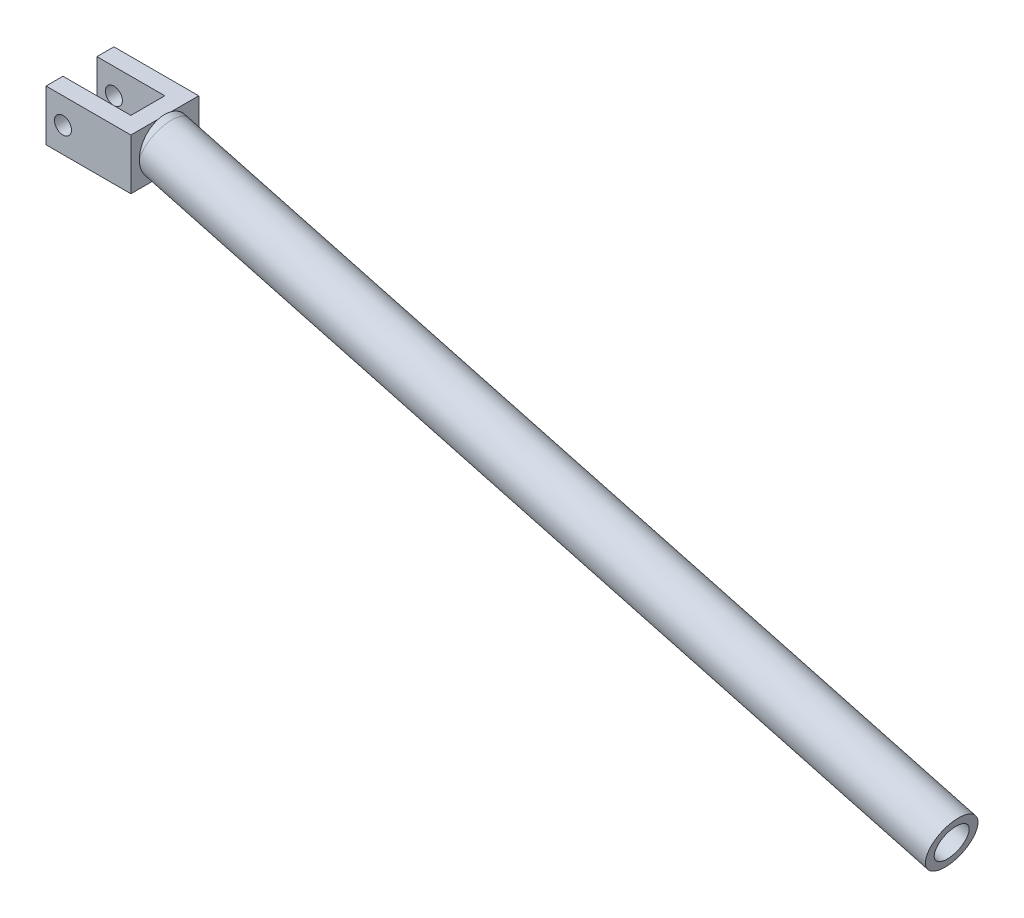
ISO-10303-21;
HEADER;
FILE_DESCRIPTION(('STEP AP214'),'2;1');
FILE_NAME('part.step','',(''),(''),'','','');
FILE_SCHEMA(('AUTOMOTIVE_DESIGN { 1 0 10303 214 1 1 1 1 }'));
ENDSEC;
DATA;
#1=APPLICATION_CONTEXT('core data for automotive mechanical design processes');
#2=APPLICATION_PROTOCOL_DEFINITION('international standard','automotive_design',2000,#1);
#3=PRODUCT_CONTEXT('',#1,'mechanical');
#4=PRODUCT('Part','Part','',(#3));
#5=PRODUCT_RELATED_PRODUCT_CATEGORY('part','',(#4));
#6=PRODUCT_DEFINITION_FORMATION('','',#4);
#7=PRODUCT_DEFINITION_CONTEXT('part definition',#1,'design');
#8=PRODUCT_DEFINITION('design','',#6,#7);
#9=PRODUCT_DEFINITION_SHAPE('','',#8);
#10=(LENGTH_UNIT() NAMED_UNIT(*) SI_UNIT(.MILLI.,.METRE.));
#11=(NAMED_UNIT(*) PLANE_ANGLE_UNIT() SI_UNIT($,.RADIAN.));
#12=(NAMED_UNIT(*) SI_UNIT($,.STERADIAN.) SOLID_ANGLE_UNIT());
#13=UNCERTAINTY_MEASURE_WITH_UNIT(LENGTH_MEASURE(1.E-05),#10,'distance_accuracy_value','');
#14=(GEOMETRIC_REPRESENTATION_CONTEXT(3) GLOBAL_UNCERTAINTY_ASSIGNED_CONTEXT((#13)) GLOBAL_UNIT_ASSIGNED_CONTEXT((#10,
#11,#12)) REPRESENTATION_CONTEXT('',''));
#15=CARTESIAN_POINT('',(0.,0.,0.));
#16=DIRECTION('',(0.,0.,1.));
#17=DIRECTION('',(1.,0.,0.));
#18=AXIS2_PLACEMENT_3D('',#15,#16,#17);
#19=CARTESIAN_POINT('',(-12.7,0.,0.));
#20=DIRECTION('',(1.,0.,0.));
#21=DIRECTION('',(0.,0.,-1.));
#22=AXIS2_PLACEMENT_3D('',#19,#20,#21);
#23=PLANE('',#22);
#24=DIRECTION('',(0.,1.,0.));
#25=VECTOR('',#24,1.);
#26=CARTESIAN_POINT('',(-12.7,19.05,-12.7000000000001));
#27=LINE('',#26,#25);
#28=CARTESIAN_POINT('',(-12.7,-19.05,-12.6999999999999));
#29=VERTEX_POINT('',#28);
#30=CARTESIAN_POINT('',(-12.7,19.05,-12.6999999999999));
#31=VERTEX_POINT('',#30);
#32=EDGE_CURVE('E176',#29,#31,#27,.T.);
#33=ORIENTED_EDGE('',*,*,#32,.F.);
#34=DIRECTION('',(0.,0.,-1.));
#35=VECTOR('',#34,1.);
#36=CARTESIAN_POINT('',(-12.7,-19.05,-25.4));
#37=LINE('',#36,#35);
#38=CARTESIAN_POINT('',(-12.7,-19.05,12.7));
#39=VERTEX_POINT('',#38);
#40=EDGE_CURVE('E208',#39,#29,#37,.T.);
#41=ORIENTED_EDGE('',*,*,#40,.F.);
#42=DIRECTION('',(0.,-1.,0.));
#43=VECTOR('',#42,1.);
#44=CARTESIAN_POINT('',(-12.7,19.05,12.7));
#45=LINE('',#44,#43);
#46=CARTESIAN_POINT('',(-12.7,19.05,12.7));
#47=VERTEX_POINT('',#46);
#48=EDGE_CURVE('E188',#47,#39,#45,.T.);
#49=ORIENTED_EDGE('',*,*,#48,.F.);
#50=DIRECTION('',(0.,0.,1.));
#51=VECTOR('',#50,1.);
#52=CARTESIAN_POINT('',(-12.7,19.05,-25.4));
#53=LINE('',#52,#51);
#54=EDGE_CURVE('E81',#31,#47,#53,.T.);
#55=ORIENTED_EDGE('',*,*,#54,.F.);
#56=EDGE_LOOP('',(#33,#41,#49,#55));
#57=FACE_BOUND('',#56,.T.);
#58=ADVANCED_FACE('F57',(#57),#23,.F.);
#59=CARTESIAN_POINT('',(0.,0.,0.));
#60=DIRECTION('',(1.,0.,0.));
#61=DIRECTION('',(0.,0.,-1.));
#62=AXIS2_PLACEMENT_3D('',#59,#60,#61);
#63=PLANE('',#62);
#64=CARTESIAN_POINT('',(0.,0.,0.));
#65=DIRECTION('',(1.,0.,0.));
#66=DIRECTION('',(0.,-1.,1.47620540963971E-12));
#67=AXIS2_PLACEMENT_3D('',#64,#65,#66);
#68=ELLIPSE('',#67,19.7220112368121,19.05);
#69=CARTESIAN_POINT('',(0.,-19.05,4.93050280920487));
#70=VERTEX_POINT('',#69);
#71=CARTESIAN_POINT('',(0.,-19.05,-4.9305028092011));
#72=VERTEX_POINT('',#71);
#73=EDGE_CURVE('E232',#70,#72,#68,.T.);
#74=ORIENTED_EDGE('',*,*,#73,.F.);
#75=DIRECTION('',(0.,0.,-1.));
#76=VECTOR('',#75,1.);
#77=CARTESIAN_POINT('',(0.,-19.05,-25.4));
#78=LINE('',#77,#76);
#79=EDGE_CURVE('E12',#70,#72,#78,.T.);
#80=ORIENTED_EDGE('',*,*,#79,.T.);
#81=EDGE_LOOP('',(#74,#80));
#82=FACE_BOUND('',#81,.T.);
#83=ADVANCED_FACE('F270',(#82),#63,.F.);
#84=CARTESIAN_POINT('',(588.828383705816,-157.776089894497,2.32909917414058E-10));
#85=DIRECTION('',(-0.965925826289068,0.258819045102521,-3.82070074498127E-13));
#86=DIRECTION('',(-0.258819045102521,-0.965925826289068,0.));
#87=AXIS2_PLACEMENT_3D('',#84,#85,#86);
#88=PLANE('',#87);
#89=CARTESIAN_POINT('',(588.828383705816,-157.776089894497,2.32909917414058E-10));
#90=DIRECTION('',(-0.965925826289068,0.258819045102521,-3.82070074498127E-13));
#91=DIRECTION('',(-0.258819045102521,-0.965925826289068,0.));
#92=AXIS2_PLACEMENT_3D('',#89,#90,#91);
#93=CIRCLE('',#92,12.7);
#94=CARTESIAN_POINT('',(585.541381833014,-170.043347888368,2.32909917414058E-10));
#95=VERTEX_POINT('',#94);
#96=EDGE_CURVE('E238',#95,#95,#93,.T.);
#97=ORIENTED_EDGE('',*,*,#96,.T.);
#98=EDGE_LOOP('',(#97));
#99=FACE_BOUND('',#98,.T.);
#100=CARTESIAN_POINT('',(588.828383705816,-157.776089894497,2.32909917414058E-10));
#101=DIRECTION('',(-0.965925826289068,0.258819045102521,-3.82070074498127E-13));
#102=DIRECTION('',(-0.258819045102521,-0.965925826289068,0.));
#103=AXIS2_PLACEMENT_3D('',#100,#101,#102);
#104=CIRCLE('',#103,19.05);
#105=CARTESIAN_POINT('',(583.897880896613,-176.176976885304,2.32909917414058E-10));
#106=VERTEX_POINT('',#105);
#107=EDGE_CURVE('E245',#106,#106,#104,.T.);
#108=ORIENTED_EDGE('',*,*,#107,.F.);
#109=EDGE_LOOP('',(#108));
#110=FACE_BOUND('',#109,.T.);
#111=ADVANCED_FACE('F59',(#99,#110),#88,.F.);
#112=CARTESIAN_POINT('',(-24.5345159877425,6.5740037456041,-9.70457989225221E-12));
#113=DIRECTION('',(0.965925826289068,-0.258819045102521,3.82070074498126E-13));
#114=DIRECTION('',(0.258819045102521,0.965925826289068,0.));
#115=AXIS2_PLACEMENT_3D('',#112,#113,#114);
#116=CYLINDRICAL_SURFACE('',#115,19.05);
#117=CARTESIAN_POINT('',(-1.11022302462516E-13,0.,0.));
#118=DIRECTION('',(-0.965925826289068,0.258819045102521,-3.82070074498127E-13));
#119=DIRECTION('',(-0.258819045102521,-0.965925826289068,0.));
#120=AXIS2_PLACEMENT_3D('',#117,#118,#119);
#121=CIRCLE('',#120,19.05);
#122=CARTESIAN_POINT('',(0.,2.85915650784312E-11,19.05));
#123=VERTEX_POINT('',#122);
#124=CARTESIAN_POINT('',(0.,-2.76518610288419E-11,-19.05));
#125=VERTEX_POINT('',#124);
#126=EDGE_CURVE('E241',#123,#125,#121,.T.);
#127=ORIENTED_EDGE('',*,*,#126,.T.);
#128=CARTESIAN_POINT('',(0.,0.,0.));
#129=DIRECTION('',(1.,0.,0.));
#130=DIRECTION('',(0.,-1.,1.47620540963971E-12));
#131=AXIS2_PLACEMENT_3D('',#128,#129,#130);
#132=ELLIPSE('',#131,19.7220112368121,19.05);
#133=CARTESIAN_POINT('',(0.,19.05,-4.93050280920503));
#134=VERTEX_POINT('',#133);
#135=EDGE_CURVE('E233',#125,#134,#132,.T.);
#136=ORIENTED_EDGE('',*,*,#135,.T.);
#137=CARTESIAN_POINT('',(0.,19.05,4.93050280920127));
#138=VERTEX_POINT('',#137);
#139=EDGE_CURVE('E237',#134,#138,#132,.T.);
#140=ORIENTED_EDGE('',*,*,#139,.T.);
#141=EDGE_CURVE('E231',#138,#123,#132,.T.);
#142=ORIENTED_EDGE('',*,*,#141,.T.);
#143=EDGE_LOOP('',(#127,#136,#140,#142));
#144=FACE_BOUND('',#143,.T.);
#145=ADVANCED_FACE('F276',(#144),#116,.T.);
#146=CARTESIAN_POINT('',(0.,0.,0.));
#147=DIRECTION('',(0.965925826289068,-0.258819045102521,3.82070074498127E-13));
#148=DIRECTION('',(0.258819045102521,0.965925826289068,0.));
#149=AXIS2_PLACEMENT_3D('',#146,#147,#148);
#150=CYLINDRICAL_SURFACE('',#149,19.05);
#151=ORIENTED_EDGE('',*,*,#107,.T.);
#152=EDGE_LOOP('',(#151));
#153=FACE_BOUND('',#152,.T.);
#154=ORIENTED_EDGE('',*,*,#126,.F.);
#155=EDGE_CURVE('E228',#123,#70,#68,.T.);
#156=ORIENTED_EDGE('',*,*,#155,.T.);
#157=ORIENTED_EDGE('',*,*,#73,.T.);
#158=EDGE_CURVE('E227',#72,#125,#68,.T.);
#159=ORIENTED_EDGE('',*,*,#158,.T.);
#160=EDGE_LOOP('',(#154,#156,#157,#159));
#161=FACE_BOUND('',#160,.T.);
#162=ADVANCED_FACE('F274',(#153,#161),#150,.T.);
#163=CARTESIAN_POINT('',(-25.5004418140314,6.83282279070665,-1.00866499667508E-11));
#164=DIRECTION('',(0.965925826289068,-0.258819045102521,3.82070074498127E-13));
#165=DIRECTION('',(0.258819045102521,0.965925826289068,0.));
#166=AXIS2_PLACEMENT_3D('',#163,#164,#165);
#167=CYLINDRICAL_SURFACE('',#166,12.7);
#168=CARTESIAN_POINT('',(0.,0.,0.));
#169=DIRECTION('',(1.,0.,0.));
#170=DIRECTION('',(0.,-1.,1.47620540963971E-12));
#171=AXIS2_PLACEMENT_3D('',#168,#169,#170);
#172=ELLIPSE('',#171,13.1480074912081,12.7);
#173=CARTESIAN_POINT('',(0.,-1.92454163028346E-11,-12.7));
#174=VERTEX_POINT('',#173);
#175=CARTESIAN_POINT('',(0.,1.82502011020141E-11,12.7));
#176=VERTEX_POINT('',#175);
#177=EDGE_CURVE('E221',#174,#176,#172,.T.);
#178=ORIENTED_EDGE('',*,*,#177,.F.);
#179=CARTESIAN_POINT('',(1.11022302462516E-13,0.,0.));
#180=DIRECTION('',(-0.965925826289068,0.258819045102521,-3.82070074498127E-13));
#181=DIRECTION('',(-0.258819045102521,-0.965925826289068,0.));
#182=AXIS2_PLACEMENT_3D('',#179,#180,#181);
#183=CIRCLE('',#182,12.7);
#184=EDGE_CURVE('E236',#176,#174,#183,.T.);
#185=ORIENTED_EDGE('',*,*,#184,.F.);
#186=EDGE_LOOP('',(#178,#185));
#187=FACE_BOUND('',#186,.T.);
#188=ADVANCED_FACE('F286',(#187),#167,.F.);
#189=CARTESIAN_POINT('',(1.11022302462516E-13,0.,0.));
#190=DIRECTION('',(0.965925826289068,-0.258819045102521,3.82070074498127E-13));
#191=DIRECTION('',(0.258819045102521,0.965925826289068,0.));
#192=AXIS2_PLACEMENT_3D('',#189,#190,#191);
#193=CYLINDRICAL_SURFACE('',#192,12.7);
#194=CARTESIAN_POINT('',(0.,0.,0.));
#195=DIRECTION('',(1.,0.,0.));
#196=DIRECTION('',(0.,-1.,1.47620540963971E-12));
#197=AXIS2_PLACEMENT_3D('',#194,#195,#196);
#198=ELLIPSE('',#197,13.1480074912081,12.7);
#199=EDGE_CURVE('E246',#176,#174,#198,.T.);
#200=ORIENTED_EDGE('',*,*,#199,.F.);
#201=ORIENTED_EDGE('',*,*,#184,.T.);
#202=EDGE_LOOP('',(#200,#201));
#203=FACE_BOUND('',#202,.T.);
#204=ORIENTED_EDGE('',*,*,#96,.F.);
#205=EDGE_LOOP('',(#204));
#206=FACE_BOUND('',#205,.T.);
#207=ADVANCED_FACE('F279',(#203,#206),#193,.F.);
#208=ORIENTED_EDGE('',*,*,#139,.F.);
#209=DIRECTION('',(0.,0.,1.));
#210=VECTOR('',#209,1.);
#211=CARTESIAN_POINT('',(0.,19.05,-25.4));
#212=LINE('',#211,#210);
#213=EDGE_CURVE('E66',#134,#138,#212,.T.);
#214=ORIENTED_EDGE('',*,*,#213,.T.);
#215=EDGE_LOOP('',(#208,#214));
#216=FACE_BOUND('',#215,.T.);
#217=ADVANCED_FACE('F277',(#216),#63,.F.);
#218=CARTESIAN_POINT('',(-12.7,-19.05,-25.4));
#219=DIRECTION('',(0.,-1.,0.));
#220=DIRECTION('',(0.,0.,-1.));
#221=AXIS2_PLACEMENT_3D('',#218,#219,#220);
#222=PLANE('',#221);
#223=CARTESIAN_POINT('',(0.,-19.05,25.4));
#224=VERTEX_POINT('',#223);
#225=EDGE_CURVE('E68',#224,#70,#78,.T.);
#226=ORIENTED_EDGE('',*,*,#225,.F.);
#227=DIRECTION('',(1.,0.,0.));
#228=VECTOR('',#227,1.);
#229=CARTESIAN_POINT('',(-12.7,-19.05,25.4));
#230=LINE('',#229,#228);
#231=CARTESIAN_POINT('',(-63.5,-19.05,25.4));
#232=VERTEX_POINT('',#231);
#233=EDGE_CURVE('E212',#232,#224,#230,.T.);
#234=ORIENTED_EDGE('',*,*,#233,.F.);
#235=DIRECTION('',(0.,0.,1.));
#236=VECTOR('',#235,1.);
#237=CARTESIAN_POINT('',(-63.5,-19.05,25.4));
#238=LINE('',#237,#236);
#239=CARTESIAN_POINT('',(-63.5,-19.05,12.7));
#240=VERTEX_POINT('',#239);
#241=EDGE_CURVE('E196',#240,#232,#238,.T.);
#242=ORIENTED_EDGE('',*,*,#241,.F.);
#243=DIRECTION('',(1.,0.,0.));
#244=VECTOR('',#243,1.);
#245=CARTESIAN_POINT('',(-63.5,-19.05,12.7));
#246=LINE('',#245,#244);
#247=EDGE_CURVE('E199',#240,#39,#246,.T.);
#248=ORIENTED_EDGE('',*,*,#247,.T.);
#249=ORIENTED_EDGE('',*,*,#40,.T.);
#250=DIRECTION('',(1.,0.,0.));
#251=VECTOR('',#250,1.);
#252=CARTESIAN_POINT('',(-63.5,-19.05,-12.6999999999999));
#253=LINE('',#252,#251);
#254=CARTESIAN_POINT('',(-63.5,-19.05,-12.6999999999999));
#255=VERTEX_POINT('',#254);
#256=EDGE_CURVE('E186',#255,#29,#253,.T.);
#257=ORIENTED_EDGE('',*,*,#256,.F.);
#258=DIRECTION('',(0.,0.,1.));
#259=VECTOR('',#258,1.);
#260=CARTESIAN_POINT('',(-63.5,-19.0500000000002,-25.3999999999999));
#261=LINE('',#260,#259);
#262=CARTESIAN_POINT('',(-63.5,-19.0500000000002,-25.3999999999999));
#263=VERTEX_POINT('',#262);
#264=EDGE_CURVE('E171',#263,#255,#261,.T.);
#265=ORIENTED_EDGE('',*,*,#264,.F.);
#266=DIRECTION('',(1.,0.,0.));
#267=VECTOR('',#266,1.);
#268=CARTESIAN_POINT('',(-12.7,-19.05,-25.4));
#269=LINE('',#268,#267);
#270=CARTESIAN_POINT('',(0.,-19.05,-25.4));
#271=VERTEX_POINT('',#270);
#272=EDGE_CURVE('E163',#263,#271,#269,.T.);
#273=ORIENTED_EDGE('',*,*,#272,.T.);
#274=EDGE_CURVE('E69',#72,#271,#78,.T.);
#275=ORIENTED_EDGE('',*,*,#274,.F.);
#276=ORIENTED_EDGE('',*,*,#79,.F.);
#277=EDGE_LOOP('',(#226,#234,#242,#248,#249,#257,#265,#273,#275,#276));
#278=FACE_BOUND('',#277,.T.);
#279=ADVANCED_FACE('F265',(#278),#222,.T.);
#280=CARTESIAN_POINT('',(-12.7,-19.05,-25.4));
#281=DIRECTION('',(0.,0.,-1.));
#282=DIRECTION('',(-1.,0.,0.));
#283=AXIS2_PLACEMENT_3D('',#280,#281,#282);
#284=PLANE('',#283);
#285=CARTESIAN_POINT('',(-50.8,0.,-25.4000000000001));
#286=DIRECTION('',(0.,0.,1.));
#287=DIRECTION('',(1.,0.,0.));
#288=AXIS2_PLACEMENT_3D('',#285,#286,#287);
#289=CIRCLE('',#288,6.35);
#290=CARTESIAN_POINT('',(-44.45,0.,-25.4000000000001));
#291=VERTEX_POINT('',#290);
#292=EDGE_CURVE('E318',#291,#291,#289,.T.);
#293=ORIENTED_EDGE('',*,*,#292,.T.);
#294=EDGE_LOOP('',(#293));
#295=FACE_BOUND('',#294,.T.);
#296=DIRECTION('',(0.,1.,0.));
#297=VECTOR('',#296,1.);
#298=CARTESIAN_POINT('',(0.,-19.05,-25.4));
#299=LINE('',#298,#297);
#300=CARTESIAN_POINT('',(0.,19.05,-25.4));
#301=VERTEX_POINT('',#300);
#302=EDGE_CURVE('E216',#271,#301,#299,.T.);
#303=ORIENTED_EDGE('',*,*,#302,.F.);
#304=ORIENTED_EDGE('',*,*,#272,.F.);
#305=DIRECTION('',(0.,-1.,0.));
#306=VECTOR('',#305,1.);
#307=CARTESIAN_POINT('',(-63.5,19.05,-25.4000000000001));
#308=LINE('',#307,#306);
#309=CARTESIAN_POINT('',(-63.5,19.05,-25.4000000000001));
#310=VERTEX_POINT('',#309);
#311=EDGE_CURVE('E166',#310,#263,#308,.T.);
#312=ORIENTED_EDGE('',*,*,#311,.F.);
#313=DIRECTION('',(1.,0.,0.));
#314=VECTOR('',#313,1.);
#315=CARTESIAN_POINT('',(-12.7,19.05,-25.4));
#316=LINE('',#315,#314);
#317=EDGE_CURVE('E152',#310,#301,#316,.T.);
#318=ORIENTED_EDGE('',*,*,#317,.T.);
#319=EDGE_LOOP('',(#303,#304,#312,#318));
#320=FACE_BOUND('',#319,.T.);
#321=ADVANCED_FACE('F167',(#295,#320),#284,.T.);
#322=CARTESIAN_POINT('',(-12.7,19.05,-25.4));
#323=DIRECTION('',(0.,1.,0.));
#324=DIRECTION('',(0.,0.,1.));
#325=AXIS2_PLACEMENT_3D('',#322,#323,#324);
#326=PLANE('',#325);
#327=EDGE_CURVE('E158',#301,#134,#212,.T.);
#328=ORIENTED_EDGE('',*,*,#327,.F.);
#329=ORIENTED_EDGE('',*,*,#317,.F.);
#330=DIRECTION('',(0.,0.,-1.));
#331=VECTOR('',#330,1.);
#332=CARTESIAN_POINT('',(-63.5,19.05,-25.4000000000001));
#333=LINE('',#332,#331);
#334=CARTESIAN_POINT('',(-63.5,19.05,-12.7000000000001));
#335=VERTEX_POINT('',#334);
#336=EDGE_CURVE('E156',#335,#310,#333,.T.);
#337=ORIENTED_EDGE('',*,*,#336,.F.);
#338=DIRECTION('',(1.,0.,0.));
#339=VECTOR('',#338,1.);
#340=CARTESIAN_POINT('',(-63.5,19.05,-12.7000000000001));
#341=LINE('',#340,#339);
#342=EDGE_CURVE('E76',#335,#31,#341,.T.);
#343=ORIENTED_EDGE('',*,*,#342,.T.);
#344=ORIENTED_EDGE('',*,*,#54,.T.);
#345=DIRECTION('',(1.,0.,0.));
#346=VECTOR('',#345,1.);
#347=CARTESIAN_POINT('',(-63.5,19.05,12.7));
#348=LINE('',#347,#346);
#349=CARTESIAN_POINT('',(-63.5,19.05,12.7));
#350=VERTEX_POINT('',#349);
#351=EDGE_CURVE('E204',#350,#47,#348,.T.);
#352=ORIENTED_EDGE('',*,*,#351,.F.);
#353=DIRECTION('',(0.,0.,-1.));
#354=VECTOR('',#353,1.);
#355=CARTESIAN_POINT('',(-63.5,19.05,25.4));
#356=LINE('',#355,#354);
#357=CARTESIAN_POINT('',(-63.5,19.05,25.4));
#358=VERTEX_POINT('',#357);
#359=EDGE_CURVE('E192',#358,#350,#356,.T.);
#360=ORIENTED_EDGE('',*,*,#359,.F.);
#361=DIRECTION('',(1.,0.,0.));
#362=VECTOR('',#361,1.);
#363=CARTESIAN_POINT('',(-12.7,19.05,25.4));
#364=LINE('',#363,#362);
#365=CARTESIAN_POINT('',(0.,19.05,25.4));
#366=VERTEX_POINT('',#365);
#367=EDGE_CURVE('E162',#358,#366,#364,.T.);
#368=ORIENTED_EDGE('',*,*,#367,.T.);
#369=EDGE_CURVE('E218',#138,#366,#212,.T.);
#370=ORIENTED_EDGE('',*,*,#369,.F.);
#371=ORIENTED_EDGE('',*,*,#213,.F.);
#372=EDGE_LOOP('',(#328,#329,#337,#343,#344,#352,#360,#368,#370,#371));
#373=FACE_BOUND('',#372,.T.);
#374=ADVANCED_FACE('F154',(#373),#326,.T.);
#375=CARTESIAN_POINT('',(-12.7,-19.05,25.4));
#376=DIRECTION('',(0.,0.,1.));
#377=DIRECTION('',(0.,-1.,0.));
#378=AXIS2_PLACEMENT_3D('',#375,#376,#377);
#379=PLANE('',#378);
#380=CARTESIAN_POINT('',(-50.8,0.,25.4));
#381=DIRECTION('',(0.,0.,1.));
#382=DIRECTION('',(1.,0.,0.));
#383=AXIS2_PLACEMENT_3D('',#380,#381,#382);
#384=CIRCLE('',#383,6.35);
#385=CARTESIAN_POINT('',(-44.45,0.,25.4));
#386=VERTEX_POINT('',#385);
#387=EDGE_CURVE('E316',#386,#386,#384,.T.);
#388=ORIENTED_EDGE('',*,*,#387,.F.);
#389=EDGE_LOOP('',(#388));
#390=FACE_BOUND('',#389,.T.);
#391=DIRECTION('',(0.,-1.,0.));
#392=VECTOR('',#391,1.);
#393=CARTESIAN_POINT('',(0.,-19.05,25.4));
#394=LINE('',#393,#392);
#395=EDGE_CURVE('E207',#366,#224,#394,.T.);
#396=ORIENTED_EDGE('',*,*,#395,.F.);
#397=ORIENTED_EDGE('',*,*,#367,.F.);
#398=DIRECTION('',(0.,1.,0.));
#399=VECTOR('',#398,1.);
#400=CARTESIAN_POINT('',(-63.5,19.05,25.4));
#401=LINE('',#400,#399);
#402=EDGE_CURVE('E189',#232,#358,#401,.T.);
#403=ORIENTED_EDGE('',*,*,#402,.F.);
#404=ORIENTED_EDGE('',*,*,#233,.T.);
#405=EDGE_LOOP('',(#396,#397,#403,#404));
#406=FACE_BOUND('',#405,.T.);
#407=ADVANCED_FACE('F261',(#390,#406),#379,.T.);
#408=CARTESIAN_POINT('',(0.,0.,0.));
#409=DIRECTION('',(1.,0.,0.));
#410=DIRECTION('',(0.,0.,-1.));
#411=AXIS2_PLACEMENT_3D('',#408,#409,#410);
#412=PLANE('',#411);
#413=ORIENTED_EDGE('',*,*,#155,.F.);
#414=ORIENTED_EDGE('',*,*,#141,.F.);
#415=ORIENTED_EDGE('',*,*,#369,.T.);
#416=ORIENTED_EDGE('',*,*,#395,.T.);
#417=ORIENTED_EDGE('',*,*,#225,.T.);
#418=EDGE_LOOP('',(#413,#414,#415,#416,#417));
#419=FACE_BOUND('',#418,.T.);
#420=ADVANCED_FACE('F255',(#419),#412,.T.);
#421=ORIENTED_EDGE('',*,*,#158,.F.);
#422=ORIENTED_EDGE('',*,*,#274,.T.);
#423=ORIENTED_EDGE('',*,*,#302,.T.);
#424=ORIENTED_EDGE('',*,*,#327,.T.);
#425=ORIENTED_EDGE('',*,*,#135,.F.);
#426=EDGE_LOOP('',(#421,#422,#423,#424,#425));
#427=FACE_BOUND('',#426,.T.);
#428=ADVANCED_FACE('F304',(#427),#412,.T.);
#429=ORIENTED_EDGE('',*,*,#199,.T.);
#430=ORIENTED_EDGE('',*,*,#177,.T.);
#431=EDGE_LOOP('',(#429,#430));
#432=FACE_BOUND('',#431,.T.);
#433=ADVANCED_FACE('F301',(#432),#412,.T.);
#434=CARTESIAN_POINT('',(-63.5,19.05,12.7));
#435=DIRECTION('',(0.,0.,1.));
#436=DIRECTION('',(0.,-1.,0.));
#437=AXIS2_PLACEMENT_3D('',#434,#435,#436);
#438=PLANE('',#437);
#439=CARTESIAN_POINT('',(-50.8,0.,12.7));
#440=DIRECTION('',(0.,0.,1.));
#441=DIRECTION('',(0.,-1.,0.));
#442=AXIS2_PLACEMENT_3D('',#439,#440,#441);
#443=CIRCLE('',#442,6.35);
#444=CARTESIAN_POINT('',(-44.45,0.,12.7));
#445=VERTEX_POINT('',#444);
#446=EDGE_CURVE('E178',#445,#445,#443,.T.);
#447=ORIENTED_EDGE('',*,*,#446,.T.);
#448=EDGE_LOOP('',(#447));
#449=FACE_BOUND('',#448,.T.);
#450=ORIENTED_EDGE('',*,*,#48,.T.);
#451=ORIENTED_EDGE('',*,*,#247,.F.);
#452=DIRECTION('',(0.,-1.,0.));
#453=VECTOR('',#452,1.);
#454=CARTESIAN_POINT('',(-63.5,19.05,12.7));
#455=LINE('',#454,#453);
#456=EDGE_CURVE('E194',#350,#240,#455,.T.);
#457=ORIENTED_EDGE('',*,*,#456,.F.);
#458=ORIENTED_EDGE('',*,*,#351,.T.);
#459=EDGE_LOOP('',(#450,#451,#457,#458));
#460=FACE_BOUND('',#459,.T.);
#461=ADVANCED_FACE('F299',(#449,#460),#438,.F.);
#462=CARTESIAN_POINT('',(-63.5,0.,0.));
#463=DIRECTION('',(1.,0.,0.));
#464=DIRECTION('',(0.,0.,-1.));
#465=AXIS2_PLACEMENT_3D('',#462,#463,#464);
#466=PLANE('',#465);
#467=ORIENTED_EDGE('',*,*,#402,.T.);
#468=ORIENTED_EDGE('',*,*,#359,.T.);
#469=ORIENTED_EDGE('',*,*,#456,.T.);
#470=ORIENTED_EDGE('',*,*,#241,.T.);
#471=EDGE_LOOP('',(#467,#468,#469,#470));
#472=FACE_BOUND('',#471,.T.);
#473=ADVANCED_FACE('F343',(#472),#466,.F.);
#474=CARTESIAN_POINT('',(-63.5,19.05,-12.7000000000001));
#475=DIRECTION('',(0.,0.,-1.));
#476=DIRECTION('',(0.,1.,0.));
#477=AXIS2_PLACEMENT_3D('',#474,#475,#476);
#478=PLANE('',#477);
#479=CARTESIAN_POINT('',(-50.8,0.,-12.7));
#480=DIRECTION('',(0.,0.,-1.));
#481=DIRECTION('',(0.,1.,0.));
#482=AXIS2_PLACEMENT_3D('',#479,#480,#481);
#483=CIRCLE('',#482,6.35);
#484=CARTESIAN_POINT('',(-44.45,0.,-12.7));
#485=VERTEX_POINT('',#484);
#486=EDGE_CURVE('E61',#485,#485,#483,.T.);
#487=ORIENTED_EDGE('',*,*,#486,.T.);
#488=EDGE_LOOP('',(#487));
#489=FACE_BOUND('',#488,.T.);
#490=ORIENTED_EDGE('',*,*,#32,.T.);
#491=ORIENTED_EDGE('',*,*,#342,.F.);
#492=DIRECTION('',(0.,1.,0.));
#493=VECTOR('',#492,1.);
#494=CARTESIAN_POINT('',(-63.5,19.05,-12.7000000000001));
#495=LINE('',#494,#493);
#496=EDGE_CURVE('E175',#255,#335,#495,.T.);
#497=ORIENTED_EDGE('',*,*,#496,.F.);
#498=ORIENTED_EDGE('',*,*,#256,.T.);
#499=EDGE_LOOP('',(#490,#491,#497,#498));
#500=FACE_BOUND('',#499,.T.);
#501=ADVANCED_FACE('F341',(#489,#500),#478,.F.);
#502=CARTESIAN_POINT('',(-63.5,0.,0.));
#503=DIRECTION('',(1.,0.,0.));
#504=DIRECTION('',(0.,0.,-1.));
#505=AXIS2_PLACEMENT_3D('',#502,#503,#504);
#506=PLANE('',#505);
#507=ORIENTED_EDGE('',*,*,#336,.T.);
#508=ORIENTED_EDGE('',*,*,#311,.T.);
#509=ORIENTED_EDGE('',*,*,#264,.T.);
#510=ORIENTED_EDGE('',*,*,#496,.T.);
#511=EDGE_LOOP('',(#507,#508,#509,#510));
#512=FACE_BOUND('',#511,.T.);
#513=ADVANCED_FACE('F173',(#512),#506,.F.);
#514=CARTESIAN_POINT('',(-50.8,0.,-25.4000000000001));
#515=DIRECTION('',(0.,0.,1.));
#516=DIRECTION('',(1.,0.,0.));
#517=AXIS2_PLACEMENT_3D('',#514,#515,#516);
#518=CYLINDRICAL_SURFACE('',#517,6.35);
#519=CARTESIAN_POINT('',(-44.45,0.,-25.4000000000001));
#520=CARTESIAN_POINT('',(-44.45,0.,-25.2677083333335));
#521=CARTESIAN_POINT('',(-44.45,0.,-25.1354166666668));
#522=CARTESIAN_POINT('',(-44.45,0.,-24.8708333333335));
#523=CARTESIAN_POINT('',(-44.45,0.,-24.7385416666668));
#524=CARTESIAN_POINT('',(-44.45,0.,-24.4739583333335));
#525=CARTESIAN_POINT('',(-44.45,0.,-24.3416666666668));
#526=CARTESIAN_POINT('',(-44.45,0.,-24.0770833333335));
#527=CARTESIAN_POINT('',(-44.45,0.,-23.9447916666668));
#528=CARTESIAN_POINT('',(-44.45,0.,-23.6802083333335));
#529=CARTESIAN_POINT('',(-44.45,0.,-23.5479166666668));
#530=CARTESIAN_POINT('',(-44.45,0.,-23.2833333333335));
#531=CARTESIAN_POINT('',(-44.45,0.,-23.1510416666668));
#532=CARTESIAN_POINT('',(-44.45,0.,-22.8864583333335));
#533=CARTESIAN_POINT('',(-44.45,0.,-22.7541666666668));
#534=CARTESIAN_POINT('',(-44.45,0.,-22.4895833333334));
#535=CARTESIAN_POINT('',(-44.45,0.,-22.3572916666668));
#536=CARTESIAN_POINT('',(-44.45,0.,-22.0927083333334));
#537=CARTESIAN_POINT('',(-44.45,0.,-21.9604166666668));
#538=CARTESIAN_POINT('',(-44.45,0.,-21.6958333333334));
#539=CARTESIAN_POINT('',(-44.45,0.,-21.5635416666668));
#540=CARTESIAN_POINT('',(-44.45,0.,-21.2989583333334));
#541=CARTESIAN_POINT('',(-44.45,0.,-21.1666666666668));
#542=CARTESIAN_POINT('',(-44.45,0.,-20.9020833333334));
#543=CARTESIAN_POINT('',(-44.45,0.,-20.7697916666668));
#544=CARTESIAN_POINT('',(-44.45,0.,-20.5052083333334));
#545=CARTESIAN_POINT('',(-44.45,0.,-20.3729166666668));
#546=CARTESIAN_POINT('',(-44.45,0.,-20.1083333333334));
#547=CARTESIAN_POINT('',(-44.45,0.,-19.9760416666668));
#548=CARTESIAN_POINT('',(-44.45,0.,-19.7114583333334));
#549=CARTESIAN_POINT('',(-44.45,0.,-19.5791666666667));
#550=CARTESIAN_POINT('',(-44.45,0.,-19.3145833333334));
#551=CARTESIAN_POINT('',(-44.45,0.,-19.1822916666667));
#552=CARTESIAN_POINT('',(-44.45,0.,-18.9177083333334));
#553=CARTESIAN_POINT('',(-44.45,0.,-18.7854166666667));
#554=CARTESIAN_POINT('',(-44.45,0.,-18.5208333333334));
#555=CARTESIAN_POINT('',(-44.45,0.,-18.3885416666667));
#556=CARTESIAN_POINT('',(-44.45,0.,-18.1239583333334));
#557=CARTESIAN_POINT('',(-44.45,0.,-17.9916666666667));
#558=CARTESIAN_POINT('',(-44.45,0.,-17.7270833333334));
#559=CARTESIAN_POINT('',(-44.45,0.,-17.5947916666667));
#560=CARTESIAN_POINT('',(-44.45,0.,-17.3302083333334));
#561=CARTESIAN_POINT('',(-44.45,0.,-17.1979166666667));
#562=CARTESIAN_POINT('',(-44.45,0.,-16.9333333333334));
#563=CARTESIAN_POINT('',(-44.45,0.,-16.8010416666667));
#564=CARTESIAN_POINT('',(-44.45,0.,-16.5364583333334));
#565=CARTESIAN_POINT('',(-44.45,0.,-16.4041666666667));
#566=CARTESIAN_POINT('',(-44.45,0.,-16.1395833333334));
#567=CARTESIAN_POINT('',(-44.45,0.,-16.0072916666667));
#568=CARTESIAN_POINT('',(-44.45,0.,-15.7427083333334));
#569=CARTESIAN_POINT('',(-44.45,0.,-15.6104166666667));
#570=CARTESIAN_POINT('',(-44.45,0.,-15.3458333333334));
#571=CARTESIAN_POINT('',(-44.45,0.,-15.2135416666667));
#572=CARTESIAN_POINT('',(-44.45,0.,-14.9489583333334));
#573=CARTESIAN_POINT('',(-44.45,0.,-14.8166666666667));
#574=CARTESIAN_POINT('',(-44.45,0.,-14.5520833333334));
#575=CARTESIAN_POINT('',(-44.45,0.,-14.4197916666667));
#576=CARTESIAN_POINT('',(-44.45,0.,-14.1552083333334));
#577=CARTESIAN_POINT('',(-44.45,0.,-14.0229166666667));
#578=CARTESIAN_POINT('',(-44.45,0.,-13.7583333333334));
#579=CARTESIAN_POINT('',(-44.45,0.,-13.6260416666667));
#580=CARTESIAN_POINT('',(-44.45,0.,-13.3614583333333));
#581=CARTESIAN_POINT('',(-44.45,0.,-13.2291666666667));
#582=CARTESIAN_POINT('',(-44.45,0.,-12.9645833333333));
#583=CARTESIAN_POINT('',(-44.45,0.,-12.8322916666667));
#584=CARTESIAN_POINT('',(-44.45,0.,-12.7));
#585=B_SPLINE_CURVE_WITH_KNOTS('',3,(#519,#520,#521,#522,#523,#524,#525,#526,#527,#528,#529,
#530,#531,#532,#533,#534,#535,#536,#537,#538,#539,#540,#541,#542,#543,#544,#545,#546,#547,#548,
#549,#550,#551,#552,#553,#554,#555,#556,#557,#558,#559,#560,#561,#562,#563,#564,#565,#566,#567,
#568,#569,#570,#571,#572,#573,#574,#575,#576,#577,#578,#579,#580,#581,#582,#583,#584),
.UNSPECIFIED.,.F.,.F.,(4,2,2,2,2,2,2,2,2,2,2,2,2,2,2,2,2,2,2,2,2,2,2,2,2,2,2,2,2,2,2,2,4),(0.,
0.396875000000005,0.79375000000001,1.19062500000001,1.58750000000002,1.98437500000002,
2.38125000000003,2.77812500000003,3.17500000000004,3.57187500000004,3.96875000000005,
4.36562500000005,4.76250000000006,5.15937500000006,5.55625000000006,5.95312500000007,
6.35000000000007,6.74687500000008,7.14375000000008,7.54062500000009,7.93750000000009,
8.33437500000009,8.7312500000001,9.1281250000001,9.52500000000011,9.92187500000011,
10.3187500000001,10.7156250000001,11.1125000000001,11.5093750000001,11.9062500000001,
12.3031250000001,12.7000000000001),.UNSPECIFIED.);
#586=EDGE_CURVE('BSEAM332',#291,#485,#585,.T.);
#587=ORIENTED_EDGE('',*,*,#292,.F.);
#588=ORIENTED_EDGE('',*,*,#486,.F.);
#589=ORIENTED_EDGE('',*,*,#586,.T.);
#590=ORIENTED_EDGE('',*,*,#586,.F.);
#591=EDGE_LOOP('',(#587,#589,#588,#590));
#592=FACE_BOUND('',#591,.T.);
#593=ADVANCED_FACE('F332',(#592),#518,.F.);
#594=CARTESIAN_POINT('',(-44.45,0.,25.4));
#595=CARTESIAN_POINT('',(-44.45,0.,25.2677083333333));
#596=CARTESIAN_POINT('',(-44.45,0.,25.1354166666667));
#597=CARTESIAN_POINT('',(-44.45,0.,24.8708333333333));
#598=CARTESIAN_POINT('',(-44.45,0.,24.7385416666667));
#599=CARTESIAN_POINT('',(-44.45,0.,24.4739583333333));
#600=CARTESIAN_POINT('',(-44.45,0.,24.3416666666667));
#601=CARTESIAN_POINT('',(-44.45,0.,24.0770833333333));
#602=CARTESIAN_POINT('',(-44.45,0.,23.9447916666667));
#603=CARTESIAN_POINT('',(-44.45,0.,23.6802083333333));
#604=CARTESIAN_POINT('',(-44.45,0.,23.5479166666667));
#605=CARTESIAN_POINT('',(-44.45,0.,23.2833333333333));
#606=CARTESIAN_POINT('',(-44.45,0.,23.1510416666667));
#607=CARTESIAN_POINT('',(-44.45,0.,22.8864583333333));
#608=CARTESIAN_POINT('',(-44.45,0.,22.7541666666667));
#609=CARTESIAN_POINT('',(-44.45,0.,22.4895833333333));
#610=CARTESIAN_POINT('',(-44.45,0.,22.3572916666667));
#611=CARTESIAN_POINT('',(-44.45,0.,22.0927083333333));
#612=CARTESIAN_POINT('',(-44.45,0.,21.9604166666667));
#613=CARTESIAN_POINT('',(-44.45,0.,21.6958333333333));
#614=CARTESIAN_POINT('',(-44.45,0.,21.5635416666667));
#615=CARTESIAN_POINT('',(-44.45,0.,21.2989583333333));
#616=CARTESIAN_POINT('',(-44.45,0.,21.1666666666667));
#617=CARTESIAN_POINT('',(-44.45,0.,20.9020833333333));
#618=CARTESIAN_POINT('',(-44.45,0.,20.7697916666667));
#619=CARTESIAN_POINT('',(-44.45,0.,20.5052083333333));
#620=CARTESIAN_POINT('',(-44.45,0.,20.3729166666667));
#621=CARTESIAN_POINT('',(-44.45,0.,20.1083333333333));
#622=CARTESIAN_POINT('',(-44.45,0.,19.9760416666667));
#623=CARTESIAN_POINT('',(-44.45,0.,19.7114583333333));
#624=CARTESIAN_POINT('',(-44.45,0.,19.5791666666667));
#625=CARTESIAN_POINT('',(-44.45,0.,19.3145833333333));
#626=CARTESIAN_POINT('',(-44.45,0.,19.1822916666667));
#627=CARTESIAN_POINT('',(-44.45,0.,18.9177083333333));
#628=CARTESIAN_POINT('',(-44.45,0.,18.7854166666667));
#629=CARTESIAN_POINT('',(-44.45,0.,18.5208333333333));
#630=CARTESIAN_POINT('',(-44.45,0.,18.3885416666667));
#631=CARTESIAN_POINT('',(-44.45,0.,18.1239583333333));
#632=CARTESIAN_POINT('',(-44.45,0.,17.9916666666667));
#633=CARTESIAN_POINT('',(-44.45,0.,17.7270833333333));
#634=CARTESIAN_POINT('',(-44.45,0.,17.5947916666667));
#635=CARTESIAN_POINT('',(-44.45,0.,17.3302083333333));
#636=CARTESIAN_POINT('',(-44.45,0.,17.1979166666667));
#637=CARTESIAN_POINT('',(-44.45,0.,16.9333333333333));
#638=CARTESIAN_POINT('',(-44.45,0.,16.8010416666667));
#639=CARTESIAN_POINT('',(-44.45,0.,16.5364583333333));
#640=CARTESIAN_POINT('',(-44.45,0.,16.4041666666667));
#641=CARTESIAN_POINT('',(-44.45,0.,16.1395833333333));
#642=CARTESIAN_POINT('',(-44.45,0.,16.0072916666667));
#643=CARTESIAN_POINT('',(-44.45,0.,15.7427083333333));
#644=CARTESIAN_POINT('',(-44.45,0.,15.6104166666667));
#645=CARTESIAN_POINT('',(-44.45,0.,15.3458333333333));
#646=CARTESIAN_POINT('',(-44.45,0.,15.2135416666667));
#647=CARTESIAN_POINT('',(-44.45,0.,14.9489583333333));
#648=CARTESIAN_POINT('',(-44.45,0.,14.8166666666667));
#649=CARTESIAN_POINT('',(-44.45,0.,14.5520833333333));
#650=CARTESIAN_POINT('',(-44.45,0.,14.4197916666667));
#651=CARTESIAN_POINT('',(-44.45,0.,14.1552083333333));
#652=CARTESIAN_POINT('',(-44.45,0.,14.0229166666667));
#653=CARTESIAN_POINT('',(-44.45,0.,13.7583333333333));
#654=CARTESIAN_POINT('',(-44.45,0.,13.6260416666667));
#655=CARTESIAN_POINT('',(-44.45,0.,13.3614583333333));
#656=CARTESIAN_POINT('',(-44.45,0.,13.2291666666667));
#657=CARTESIAN_POINT('',(-44.45,0.,12.9645833333333));
#658=CARTESIAN_POINT('',(-44.45,0.,12.8322916666667));
#659=CARTESIAN_POINT('',(-44.45,0.,12.7));
#660=B_SPLINE_CURVE_WITH_KNOTS('',3,(#594,#595,#596,#597,#598,#599,#600,#601,#602,#603,#604,
#605,#606,#607,#608,#609,#610,#611,#612,#613,#614,#615,#616,#617,#618,#619,#620,#621,#622,#623,
#624,#625,#626,#627,#628,#629,#630,#631,#632,#633,#634,#635,#636,#637,#638,#639,#640,#641,#642,
#643,#644,#645,#646,#647,#648,#649,#650,#651,#652,#653,#654,#655,#656,#657,#658,#659),
.UNSPECIFIED.,.F.,.F.,(4,2,2,2,2,2,2,2,2,2,2,2,2,2,2,2,2,2,2,2,2,2,2,2,2,2,2,2,2,2,2,2,4),(0.,
0.396874999999998,0.793750000000003,1.190625,1.5875,1.984375,2.38125,2.778125,3.175,3.571875,
3.96875,4.365625,4.7625,5.159375,5.55625,5.953125,6.35,6.746875,7.14375,7.540625,7.9375,
8.334375,8.73125,9.128125,9.52500000000001,9.921875,10.31875,10.715625,11.1125,11.509375,
11.90625,12.303125,12.7),.UNSPECIFIED.);
#661=EDGE_CURVE('BSEAM330',#386,#445,#660,.T.);
#662=ORIENTED_EDGE('',*,*,#387,.T.);
#663=ORIENTED_EDGE('',*,*,#446,.F.);
#664=ORIENTED_EDGE('',*,*,#661,.T.);
#665=ORIENTED_EDGE('',*,*,#661,.F.);
#666=EDGE_LOOP('',(#662,#664,#663,#665));
#667=FACE_BOUND('',#666,.T.);
#668=ADVANCED_FACE('F330',(#667),#518,.F.);
#669=CLOSED_SHELL('',(#58,#83,#111,#145,#162,#188,#207,#217,#279,#321,#374,#407,#420,#428,#433,
#461,#473,#501,#513,#593,#668));
#670=MANIFOLD_SOLID_BREP('B2',#669);
#671=ADVANCED_BREP_SHAPE_REPRESENTATION('',(#18,#670),#14);
#672=SHAPE_DEFINITION_REPRESENTATION(#9,#671);
ENDSEC;
END-ISO-10303-21;
